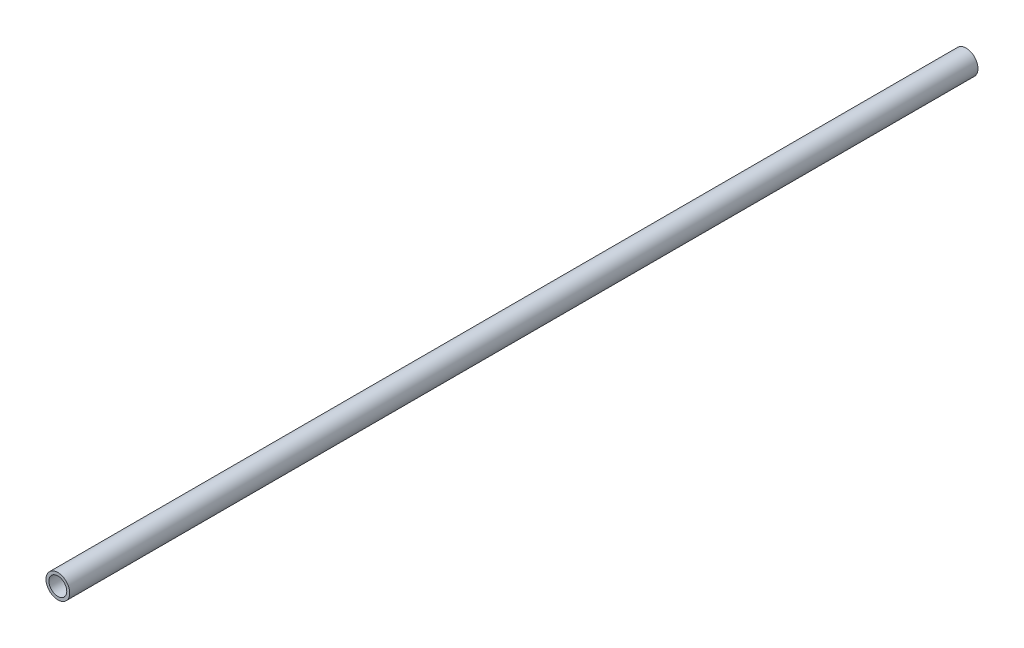
ISO-10303-21;
HEADER;
FILE_DESCRIPTION(('STEP AP214'),'2;1');
FILE_NAME('part.step','',(''),(''),'','','');
FILE_SCHEMA(('AUTOMOTIVE_DESIGN { 1 0 10303 214 1 1 1 1 }'));
ENDSEC;
DATA;
#1=APPLICATION_CONTEXT('core data for automotive mechanical design processes');
#2=APPLICATION_PROTOCOL_DEFINITION('international standard','automotive_design',2000,#1);
#3=PRODUCT_CONTEXT('',#1,'mechanical');
#4=PRODUCT('Part','Part','',(#3));
#5=PRODUCT_RELATED_PRODUCT_CATEGORY('part','',(#4));
#6=PRODUCT_DEFINITION_FORMATION('','',#4);
#7=PRODUCT_DEFINITION_CONTEXT('part definition',#1,'design');
#8=PRODUCT_DEFINITION('design','',#6,#7);
#9=PRODUCT_DEFINITION_SHAPE('','',#8);
#10=(LENGTH_UNIT() NAMED_UNIT(*) SI_UNIT(.MILLI.,.METRE.));
#11=(NAMED_UNIT(*) PLANE_ANGLE_UNIT() SI_UNIT($,.RADIAN.));
#12=(NAMED_UNIT(*) SI_UNIT($,.STERADIAN.) SOLID_ANGLE_UNIT());
#13=UNCERTAINTY_MEASURE_WITH_UNIT(LENGTH_MEASURE(1.E-05),#10,'distance_accuracy_value','');
#14=(GEOMETRIC_REPRESENTATION_CONTEXT(3) GLOBAL_UNCERTAINTY_ASSIGNED_CONTEXT((#13)) GLOBAL_UNIT_ASSIGNED_CONTEXT((#10,
#11,#12)) REPRESENTATION_CONTEXT('',''));
#15=CARTESIAN_POINT('',(0.,0.,0.));
#16=DIRECTION('',(0.,0.,1.));
#17=DIRECTION('',(1.,0.,0.));
#18=AXIS2_PLACEMENT_3D('',#15,#16,#17);
#19=CARTESIAN_POINT('',(0.,0.,306.));
#20=DIRECTION('',(0.,0.,1.));
#21=DIRECTION('',(1.,0.,0.));
#22=AXIS2_PLACEMENT_3D('',#19,#20,#21);
#23=PLANE('',#22);
#24=CARTESIAN_POINT('',(0.,0.,306.));
#25=DIRECTION('',(0.,0.,1.));
#26=DIRECTION('',(1.,0.,0.));
#27=AXIS2_PLACEMENT_3D('',#24,#25,#26);
#28=CIRCLE('',#27,4.);
#29=CARTESIAN_POINT('',(4.,0.,306.));
#30=VERTEX_POINT('',#29);
#31=EDGE_CURVE('E10',#30,#30,#28,.T.);
#32=ORIENTED_EDGE('',*,*,#31,.T.);
#33=EDGE_LOOP('',(#32));
#34=FACE_BOUND('',#33,.T.);
#35=CARTESIAN_POINT('',(0.,0.,306.));
#36=DIRECTION('',(0.,0.,1.));
#37=DIRECTION('',(1.,0.,0.));
#38=AXIS2_PLACEMENT_3D('',#35,#36,#37);
#39=CIRCLE('',#38,3.);
#40=CARTESIAN_POINT('',(3.,0.,306.));
#41=VERTEX_POINT('',#40);
#42=EDGE_CURVE('E43',#41,#41,#39,.T.);
#43=ORIENTED_EDGE('',*,*,#42,.F.);
#44=EDGE_LOOP('',(#43));
#45=FACE_BOUND('',#44,.T.);
#46=ADVANCED_FACE('F32',(#34,#45),#23,.T.);
#47=CARTESIAN_POINT('',(0.,0.,0.));
#48=DIRECTION('',(0.,0.,1.));
#49=DIRECTION('',(1.,0.,0.));
#50=AXIS2_PLACEMENT_3D('',#47,#48,#49);
#51=PLANE('',#50);
#52=CARTESIAN_POINT('',(0.,0.,0.));
#53=DIRECTION('',(0.,0.,1.));
#54=DIRECTION('',(1.,0.,0.));
#55=AXIS2_PLACEMENT_3D('',#52,#53,#54);
#56=CIRCLE('',#55,4.);
#57=CARTESIAN_POINT('',(4.,0.,0.));
#58=VERTEX_POINT('',#57);
#59=EDGE_CURVE('E36',#58,#58,#56,.T.);
#60=ORIENTED_EDGE('',*,*,#59,.F.);
#61=EDGE_LOOP('',(#60));
#62=FACE_BOUND('',#61,.T.);
#63=CARTESIAN_POINT('',(0.,0.,0.));
#64=DIRECTION('',(0.,0.,1.));
#65=DIRECTION('',(1.,0.,0.));
#66=AXIS2_PLACEMENT_3D('',#63,#64,#65);
#67=CIRCLE('',#66,3.);
#68=CARTESIAN_POINT('',(3.,0.,0.));
#69=VERTEX_POINT('',#68);
#70=EDGE_CURVE('E45',#69,#69,#67,.T.);
#71=ORIENTED_EDGE('',*,*,#70,.T.);
#72=EDGE_LOOP('',(#71));
#73=FACE_BOUND('',#72,.T.);
#74=ADVANCED_FACE('F55',(#62,#73),#51,.F.);
#75=CARTESIAN_POINT('',(0.,0.,306.));
#76=DIRECTION('',(0.,0.,-1.));
#77=DIRECTION('',(-1.,0.,0.));
#78=AXIS2_PLACEMENT_3D('',#75,#76,#77);
#79=CYLINDRICAL_SURFACE('',#78,4.);
#80=ORIENTED_EDGE('',*,*,#31,.F.);
#81=EDGE_LOOP('',(#80));
#82=FACE_BOUND('',#81,.T.);
#83=ORIENTED_EDGE('',*,*,#59,.T.);
#84=EDGE_LOOP('',(#83));
#85=FACE_BOUND('',#84,.T.);
#86=ADVANCED_FACE('F34',(#82,#85),#79,.T.);
#87=CARTESIAN_POINT('',(0.,0.,306.));
#88=DIRECTION('',(0.,0.,-1.));
#89=DIRECTION('',(-1.,0.,0.));
#90=AXIS2_PLACEMENT_3D('',#87,#88,#89);
#91=CYLINDRICAL_SURFACE('',#90,3.);
#92=ORIENTED_EDGE('',*,*,#42,.T.);
#93=EDGE_LOOP('',(#92));
#94=FACE_BOUND('',#93,.T.);
#95=ORIENTED_EDGE('',*,*,#70,.F.);
#96=EDGE_LOOP('',(#95));
#97=FACE_BOUND('',#96,.T.);
#98=ADVANCED_FACE('F51',(#94,#97),#91,.F.);
#99=CLOSED_SHELL('',(#46,#74,#86,#98));
#100=MANIFOLD_SOLID_BREP('B2',#99);
#101=ADVANCED_BREP_SHAPE_REPRESENTATION('',(#18,#100),#14);
#102=SHAPE_DEFINITION_REPRESENTATION(#9,#101);
ENDSEC;
END-ISO-10303-21;
